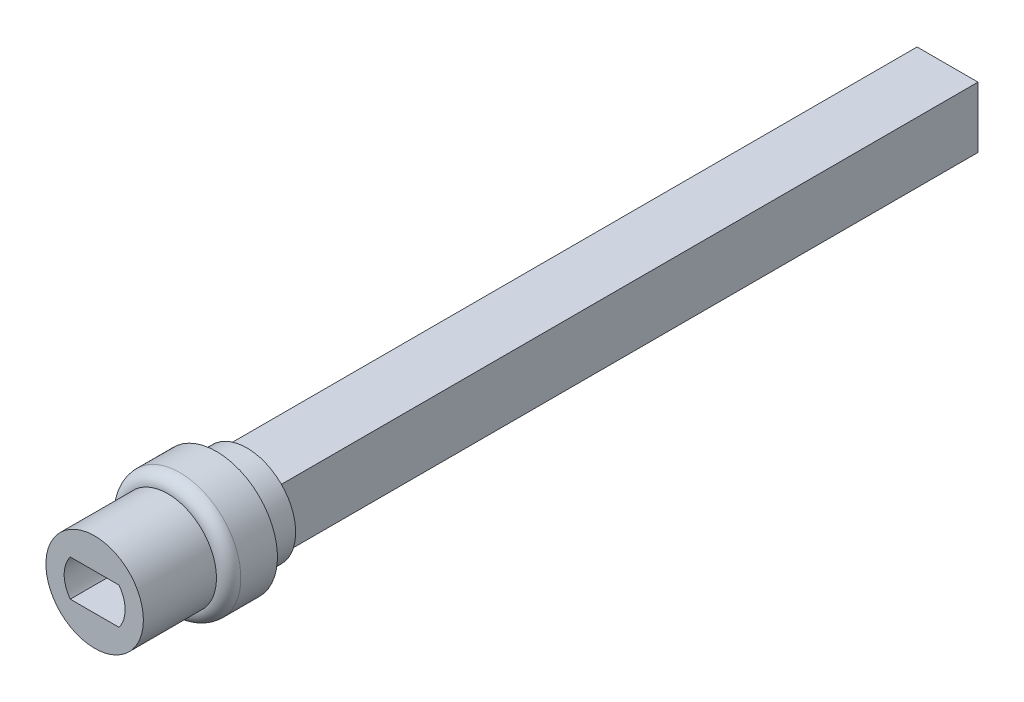
ISO-10303-21;
HEADER;
FILE_DESCRIPTION(('STEP AP214'),'2;1');
FILE_NAME('part.step','',(''),(''),'','','');
FILE_SCHEMA(('AUTOMOTIVE_DESIGN { 1 0 10303 214 1 1 1 1 }'));
ENDSEC;
DATA;
#1=APPLICATION_CONTEXT('core data for automotive mechanical design processes');
#2=APPLICATION_PROTOCOL_DEFINITION('international standard','automotive_design',2000,#1);
#3=PRODUCT_CONTEXT('',#1,'mechanical');
#4=PRODUCT('Part','Part','',(#3));
#5=PRODUCT_RELATED_PRODUCT_CATEGORY('part','',(#4));
#6=PRODUCT_DEFINITION_FORMATION('','',#4);
#7=PRODUCT_DEFINITION_CONTEXT('part definition',#1,'design');
#8=PRODUCT_DEFINITION('design','',#6,#7);
#9=PRODUCT_DEFINITION_SHAPE('','',#8);
#10=(LENGTH_UNIT() NAMED_UNIT(*) SI_UNIT(.MILLI.,.METRE.));
#11=(NAMED_UNIT(*) PLANE_ANGLE_UNIT() SI_UNIT($,.RADIAN.));
#12=(NAMED_UNIT(*) SI_UNIT($,.STERADIAN.) SOLID_ANGLE_UNIT());
#13=UNCERTAINTY_MEASURE_WITH_UNIT(LENGTH_MEASURE(1.E-05),#10,'distance_accuracy_value','');
#14=(GEOMETRIC_REPRESENTATION_CONTEXT(3) GLOBAL_UNCERTAINTY_ASSIGNED_CONTEXT((#13)) GLOBAL_UNIT_ASSIGNED_CONTEXT((#10,
#11,#12)) REPRESENTATION_CONTEXT('',''));
#15=CARTESIAN_POINT('',(0.,0.,0.));
#16=DIRECTION('',(0.,0.,1.));
#17=DIRECTION('',(1.,0.,0.));
#18=AXIS2_PLACEMENT_3D('',#15,#16,#17);
#19=CARTESIAN_POINT('',(0.,0.,6.));
#20=DIRECTION('',(0.,0.,1.));
#21=DIRECTION('',(1.,0.,0.));
#22=AXIS2_PLACEMENT_3D('',#19,#20,#21);
#23=PLANE('',#22);
#24=CARTESIAN_POINT('',(0.,0.,6.));
#25=DIRECTION('',(0.,0.,1.));
#26=DIRECTION('',(1.,0.,0.));
#27=AXIS2_PLACEMENT_3D('',#24,#25,#26);
#28=CIRCLE('',#27,4.);
#29=CARTESIAN_POINT('',(4.,0.,6.));
#30=VERTEX_POINT('',#29);
#31=EDGE_CURVE('E157',#30,#30,#28,.T.);
#32=ORIENTED_EDGE('',*,*,#31,.T.);
#33=EDGE_LOOP('',(#32));
#34=FACE_BOUND('',#33,.T.);
#35=DIRECTION('',(1.,0.,0.));
#36=VECTOR('',#35,1.);
#37=CARTESIAN_POINT('',(-2.,-1.5,6.));
#38=LINE('',#37,#36);
#39=CARTESIAN_POINT('',(-2.,-1.5,6.));
#40=VERTEX_POINT('',#39);
#41=CARTESIAN_POINT('',(2.,-1.5,6.));
#42=VERTEX_POINT('',#41);
#43=EDGE_CURVE('E131',#40,#42,#38,.T.);
#44=ORIENTED_EDGE('',*,*,#43,.F.);
#45=CARTESIAN_POINT('',(0.,0.,6.));
#46=DIRECTION('',(0.,0.,1.));
#47=DIRECTION('',(1.,0.,0.));
#48=AXIS2_PLACEMENT_3D('',#45,#46,#47);
#49=CIRCLE('',#48,2.5);
#50=CARTESIAN_POINT('',(-2.,1.5,6.));
#51=VERTEX_POINT('',#50);
#52=EDGE_CURVE('E129',#51,#40,#49,.T.);
#53=ORIENTED_EDGE('',*,*,#52,.F.);
#54=DIRECTION('',(-1.,0.,0.));
#55=VECTOR('',#54,1.);
#56=CARTESIAN_POINT('',(-2.,1.5,6.));
#57=LINE('',#56,#55);
#58=CARTESIAN_POINT('',(2.,1.5,6.));
#59=VERTEX_POINT('',#58);
#60=EDGE_CURVE('E136',#59,#51,#57,.T.);
#61=ORIENTED_EDGE('',*,*,#60,.F.);
#62=CARTESIAN_POINT('',(0.,0.,6.));
#63=DIRECTION('',(0.,0.,1.));
#64=DIRECTION('',(1.,0.,0.));
#65=AXIS2_PLACEMENT_3D('',#62,#63,#64);
#66=CIRCLE('',#65,2.5);
#67=EDGE_CURVE('E134',#42,#59,#66,.T.);
#68=ORIENTED_EDGE('',*,*,#67,.F.);
#69=EDGE_LOOP('',(#44,#53,#61,#68));
#70=FACE_BOUND('',#69,.T.);
#71=ADVANCED_FACE('F33',(#34,#70),#23,.T.);
#72=CARTESIAN_POINT('',(0.,0.,6.));
#73=DIRECTION('',(0.,0.,-1.));
#74=DIRECTION('',(-1.,0.,0.));
#75=AXIS2_PLACEMENT_3D('',#72,#73,#74);
#76=CYLINDRICAL_SURFACE('',#75,4.);
#77=ORIENTED_EDGE('',*,*,#31,.F.);
#78=EDGE_LOOP('',(#77));
#79=FACE_BOUND('',#78,.T.);
#80=CARTESIAN_POINT('',(0.,0.,0.));
#81=DIRECTION('',(0.,0.,1.));
#82=DIRECTION('',(1.,0.,0.));
#83=AXIS2_PLACEMENT_3D('',#80,#81,#82);
#84=CIRCLE('',#83,4.);
#85=CARTESIAN_POINT('',(4.,0.,0.));
#86=VERTEX_POINT('',#85);
#87=EDGE_CURVE('E128',#86,#86,#84,.T.);
#88=ORIENTED_EDGE('',*,*,#87,.T.);
#89=EDGE_LOOP('',(#88));
#90=FACE_BOUND('',#89,.T.);
#91=ADVANCED_FACE('F183',(#79,#90),#76,.T.);
#92=CARTESIAN_POINT('',(0.,0.,6.));
#93=DIRECTION('',(0.,0.,-1.));
#94=DIRECTION('',(-1.,0.,0.));
#95=AXIS2_PLACEMENT_3D('',#92,#93,#94);
#96=CYLINDRICAL_SURFACE('',#95,2.5);
#97=CARTESIAN_POINT('',(0.,0.,0.));
#98=DIRECTION('',(0.,0.,1.));
#99=DIRECTION('',(1.,0.,0.));
#100=AXIS2_PLACEMENT_3D('',#97,#98,#99);
#101=CIRCLE('',#100,2.5);
#102=CARTESIAN_POINT('',(-2.,1.5,0.));
#103=VERTEX_POINT('',#102);
#104=CARTESIAN_POINT('',(-2.,-1.5,0.));
#105=VERTEX_POINT('',#104);
#106=EDGE_CURVE('E139',#103,#105,#101,.T.);
#107=ORIENTED_EDGE('',*,*,#106,.F.);
#108=DIRECTION('',(0.,0.,-1.));
#109=VECTOR('',#108,1.);
#110=CARTESIAN_POINT('',(-2.,1.5,6.));
#111=LINE('',#110,#109);
#112=EDGE_CURVE('E138',#51,#103,#111,.T.);
#113=ORIENTED_EDGE('',*,*,#112,.F.);
#114=ORIENTED_EDGE('',*,*,#52,.T.);
#115=DIRECTION('',(0.,0.,-1.));
#116=VECTOR('',#115,1.);
#117=CARTESIAN_POINT('',(-2.,-1.5,6.));
#118=LINE('',#117,#116);
#119=EDGE_CURVE('E154',#40,#105,#118,.T.);
#120=ORIENTED_EDGE('',*,*,#119,.T.);
#121=EDGE_LOOP('',(#107,#113,#114,#120));
#122=FACE_BOUND('',#121,.T.);
#123=ADVANCED_FACE('F189',(#122),#96,.F.);
#124=CARTESIAN_POINT('',(-2.,-1.5,6.));
#125=DIRECTION('',(0.,1.,0.));
#126=DIRECTION('',(0.,0.,1.));
#127=AXIS2_PLACEMENT_3D('',#124,#125,#126);
#128=PLANE('',#127);
#129=DIRECTION('',(1.,0.,0.));
#130=VECTOR('',#129,1.);
#131=CARTESIAN_POINT('',(-2.,-1.5,0.));
#132=LINE('',#131,#130);
#133=CARTESIAN_POINT('',(2.,-1.5,0.));
#134=VERTEX_POINT('',#133);
#135=EDGE_CURVE('E142',#105,#134,#132,.T.);
#136=ORIENTED_EDGE('',*,*,#135,.F.);
#137=ORIENTED_EDGE('',*,*,#119,.F.);
#138=ORIENTED_EDGE('',*,*,#43,.T.);
#139=DIRECTION('',(0.,0.,-1.));
#140=VECTOR('',#139,1.);
#141=CARTESIAN_POINT('',(2.,-1.5,6.));
#142=LINE('',#141,#140);
#143=EDGE_CURVE('E152',#42,#134,#142,.T.);
#144=ORIENTED_EDGE('',*,*,#143,.T.);
#145=EDGE_LOOP('',(#136,#137,#138,#144));
#146=FACE_BOUND('',#145,.T.);
#147=ADVANCED_FACE('F195',(#146),#128,.T.);
#148=CARTESIAN_POINT('',(0.,0.,6.));
#149=DIRECTION('',(0.,0.,-1.));
#150=DIRECTION('',(-1.,0.,0.));
#151=AXIS2_PLACEMENT_3D('',#148,#149,#150);
#152=CYLINDRICAL_SURFACE('',#151,2.5);
#153=CARTESIAN_POINT('',(0.,0.,0.));
#154=DIRECTION('',(0.,0.,1.));
#155=DIRECTION('',(1.,0.,0.));
#156=AXIS2_PLACEMENT_3D('',#153,#154,#155);
#157=CIRCLE('',#156,2.5);
#158=CARTESIAN_POINT('',(2.,1.5,0.));
#159=VERTEX_POINT('',#158);
#160=EDGE_CURVE('E145',#134,#159,#157,.T.);
#161=ORIENTED_EDGE('',*,*,#160,.F.);
#162=ORIENTED_EDGE('',*,*,#143,.F.);
#163=ORIENTED_EDGE('',*,*,#67,.T.);
#164=DIRECTION('',(0.,0.,-1.));
#165=VECTOR('',#164,1.);
#166=CARTESIAN_POINT('',(2.,1.5,6.));
#167=LINE('',#166,#165);
#168=EDGE_CURVE('E55',#59,#159,#167,.T.);
#169=ORIENTED_EDGE('',*,*,#168,.T.);
#170=EDGE_LOOP('',(#161,#162,#163,#169));
#171=FACE_BOUND('',#170,.T.);
#172=ADVANCED_FACE('F199',(#171),#152,.F.);
#173=CARTESIAN_POINT('',(-2.,1.5,6.));
#174=DIRECTION('',(0.,-1.,0.));
#175=DIRECTION('',(0.,0.,-1.));
#176=AXIS2_PLACEMENT_3D('',#173,#174,#175);
#177=PLANE('',#176);
#178=DIRECTION('',(-1.,0.,0.));
#179=VECTOR('',#178,1.);
#180=CARTESIAN_POINT('',(-2.,1.5,0.));
#181=LINE('',#180,#179);
#182=EDGE_CURVE('E132',#159,#103,#181,.T.);
#183=ORIENTED_EDGE('',*,*,#182,.F.);
#184=ORIENTED_EDGE('',*,*,#168,.F.);
#185=ORIENTED_EDGE('',*,*,#60,.T.);
#186=ORIENTED_EDGE('',*,*,#112,.T.);
#187=EDGE_LOOP('',(#183,#184,#185,#186));
#188=FACE_BOUND('',#187,.T.);
#189=ADVANCED_FACE('F203',(#188),#177,.T.);
#190=CARTESIAN_POINT('',(0.,0.,0.));
#191=DIRECTION('',(0.,0.,-1.));
#192=DIRECTION('',(-1.,0.,0.));
#193=AXIS2_PLACEMENT_3D('',#190,#191,#192);
#194=PLANE('',#193);
#195=ORIENTED_EDGE('',*,*,#182,.T.);
#196=ORIENTED_EDGE('',*,*,#106,.T.);
#197=ORIENTED_EDGE('',*,*,#135,.T.);
#198=ORIENTED_EDGE('',*,*,#160,.T.);
#199=EDGE_LOOP('',(#195,#196,#197,#198));
#200=FACE_BOUND('',#199,.T.);
#201=ADVANCED_FACE('F207',(#200),#194,.F.);
#202=CARTESIAN_POINT('',(0.,0.,-4.));
#203=DIRECTION('',(0.,0.,1.));
#204=DIRECTION('',(1.,0.,0.));
#205=AXIS2_PLACEMENT_3D('',#202,#203,#204);
#206=CYLINDRICAL_SURFACE('',#205,5.);
#207=CARTESIAN_POINT('',(0.,0.,-1.));
#208=DIRECTION('',(0.,0.,-1.));
#209=DIRECTION('',(-1.,0.,0.));
#210=AXIS2_PLACEMENT_3D('',#207,#208,#209);
#211=CIRCLE('',#210,5.);
#212=CARTESIAN_POINT('',(-5.,0.,-1.));
#213=VERTEX_POINT('',#212);
#214=EDGE_CURVE('E41',#213,#213,#211,.T.);
#215=ORIENTED_EDGE('',*,*,#214,.T.);
#216=EDGE_LOOP('',(#215));
#217=FACE_BOUND('',#216,.T.);
#218=CARTESIAN_POINT('',(0.,0.,-4.));
#219=DIRECTION('',(0.,0.,-1.));
#220=DIRECTION('',(-1.,0.,0.));
#221=AXIS2_PLACEMENT_3D('',#218,#219,#220);
#222=CIRCLE('',#221,5.);
#223=CARTESIAN_POINT('',(-5.,0.,-4.));
#224=VERTEX_POINT('',#223);
#225=EDGE_CURVE('E125',#224,#224,#222,.T.);
#226=ORIENTED_EDGE('',*,*,#225,.F.);
#227=EDGE_LOOP('',(#226));
#228=FACE_BOUND('',#227,.T.);
#229=ADVANCED_FACE('F164',(#217,#228),#206,.T.);
#230=CARTESIAN_POINT('',(0.,0.,-4.));
#231=DIRECTION('',(0.,0.,-1.));
#232=DIRECTION('',(-1.,0.,0.));
#233=AXIS2_PLACEMENT_3D('',#230,#231,#232);
#234=PLANE('',#233);
#235=CARTESIAN_POINT('',(0.,0.,-4.));
#236=DIRECTION('',(0.,0.,-1.));
#237=DIRECTION('',(-1.,0.,0.));
#238=AXIS2_PLACEMENT_3D('',#235,#236,#237);
#239=CIRCLE('',#238,4.);
#240=CARTESIAN_POINT('',(-4.,0.,-4.));
#241=VERTEX_POINT('',#240);
#242=EDGE_CURVE('E238',#241,#241,#239,.T.);
#243=ORIENTED_EDGE('',*,*,#242,.F.);
#244=EDGE_LOOP('',(#243));
#245=FACE_BOUND('',#244,.T.);
#246=ORIENTED_EDGE('',*,*,#225,.T.);
#247=EDGE_LOOP('',(#246));
#248=FACE_BOUND('',#247,.T.);
#249=ADVANCED_FACE('F168',(#245,#248),#234,.T.);
#250=CARTESIAN_POINT('',(0.,0.,-1.));
#251=DIRECTION('',(0.,0.,-1.));
#252=DIRECTION('',(-1.,0.,0.));
#253=AXIS2_PLACEMENT_3D('',#250,#251,#252);
#254=TOROIDAL_SURFACE('',#253,4.,1.);
#255=ORIENTED_EDGE('',*,*,#87,.F.);
#256=EDGE_LOOP('',(#255));
#257=FACE_BOUND('',#256,.T.);
#258=ORIENTED_EDGE('',*,*,#214,.F.);
#259=EDGE_LOOP('',(#258));
#260=FACE_BOUND('',#259,.T.);
#261=ADVANCED_FACE('F35',(#257,#260),#254,.T.);
#262=CARTESIAN_POINT('',(0.,0.,-6.5));
#263=DIRECTION('',(0.,0.,-1.));
#264=DIRECTION('',(-1.,0.,0.));
#265=AXIS2_PLACEMENT_3D('',#262,#263,#264);
#266=PLANE('',#265);
#267=CARTESIAN_POINT('',(0.,0.,-6.5));
#268=DIRECTION('',(0.,0.,-1.));
#269=DIRECTION('',(-1.,0.,0.));
#270=AXIS2_PLACEMENT_3D('',#267,#268,#269);
#271=CIRCLE('',#270,4.);
#272=CARTESIAN_POINT('',(-4.,0.,-6.5));
#273=VERTEX_POINT('',#272);
#274=EDGE_CURVE('E112',#273,#273,#271,.T.);
#275=ORIENTED_EDGE('',*,*,#274,.T.);
#276=EDGE_LOOP('',(#275));
#277=FACE_BOUND('',#276,.T.);
#278=DIRECTION('',(0.,-1.,0.));
#279=VECTOR('',#278,1.);
#280=CARTESIAN_POINT('',(2.5,-2.5,-6.5));
#281=LINE('',#280,#279);
#282=CARTESIAN_POINT('',(2.5,2.5,-6.50000000000001));
#283=VERTEX_POINT('',#282);
#284=CARTESIAN_POINT('',(2.5,-2.5,-6.5));
#285=VERTEX_POINT('',#284);
#286=EDGE_CURVE('E48',#283,#285,#281,.T.);
#287=ORIENTED_EDGE('',*,*,#286,.F.);
#288=DIRECTION('',(1.,0.,0.));
#289=VECTOR('',#288,1.);
#290=CARTESIAN_POINT('',(-2.5,2.5,-6.5));
#291=LINE('',#290,#289);
#292=CARTESIAN_POINT('',(-2.5,2.5,-6.5));
#293=VERTEX_POINT('',#292);
#294=EDGE_CURVE('E11',#293,#283,#291,.T.);
#295=ORIENTED_EDGE('',*,*,#294,.F.);
#296=DIRECTION('',(0.,1.,0.));
#297=VECTOR('',#296,1.);
#298=CARTESIAN_POINT('',(-2.5,-2.5,-6.5));
#299=LINE('',#298,#297);
#300=CARTESIAN_POINT('',(-2.5,-2.5,-6.5));
#301=VERTEX_POINT('',#300);
#302=EDGE_CURVE('E96',#301,#293,#299,.T.);
#303=ORIENTED_EDGE('',*,*,#302,.F.);
#304=DIRECTION('',(-1.,0.,0.));
#305=VECTOR('',#304,1.);
#306=CARTESIAN_POINT('',(-2.5,-2.5,-6.5));
#307=LINE('',#306,#305);
#308=EDGE_CURVE('E111',#285,#301,#307,.T.);
#309=ORIENTED_EDGE('',*,*,#308,.F.);
#310=EDGE_LOOP('',(#287,#295,#303,#309));
#311=FACE_BOUND('',#310,.T.);
#312=ADVANCED_FACE('F95',(#277,#311),#266,.T.);
#313=CARTESIAN_POINT('',(0.,0.,-6.5));
#314=DIRECTION('',(0.,0.,1.));
#315=DIRECTION('',(1.,0.,0.));
#316=AXIS2_PLACEMENT_3D('',#313,#314,#315);
#317=CYLINDRICAL_SURFACE('',#316,4.);
#318=ORIENTED_EDGE('',*,*,#274,.F.);
#319=EDGE_LOOP('',(#318));
#320=FACE_BOUND('',#319,.T.);
#321=ORIENTED_EDGE('',*,*,#242,.T.);
#322=EDGE_LOOP('',(#321));
#323=FACE_BOUND('',#322,.T.);
#324=ADVANCED_FACE('F175',(#320,#323),#317,.T.);
#325=CARTESIAN_POINT('',(0.,0.,-64.));
#326=DIRECTION('',(0.,0.,-1.));
#327=DIRECTION('',(-1.,0.,0.));
#328=AXIS2_PLACEMENT_3D('',#325,#326,#327);
#329=PLANE('',#328);
#330=DIRECTION('',(0.,-1.,0.));
#331=VECTOR('',#330,1.);
#332=CARTESIAN_POINT('',(2.5,-2.5,-64.));
#333=LINE('',#332,#331);
#334=CARTESIAN_POINT('',(2.5,2.5,-64.));
#335=VERTEX_POINT('',#334);
#336=CARTESIAN_POINT('',(2.5,-2.5,-64.));
#337=VERTEX_POINT('',#336);
#338=EDGE_CURVE('E244',#335,#337,#333,.T.);
#339=ORIENTED_EDGE('',*,*,#338,.T.);
#340=DIRECTION('',(-1.,0.,0.));
#341=VECTOR('',#340,1.);
#342=CARTESIAN_POINT('',(-2.5,-2.5,-64.));
#343=LINE('',#342,#341);
#344=CARTESIAN_POINT('',(-2.5,-2.5,-64.));
#345=VERTEX_POINT('',#344);
#346=EDGE_CURVE('E247',#337,#345,#343,.T.);
#347=ORIENTED_EDGE('',*,*,#346,.T.);
#348=DIRECTION('',(0.,1.,0.));
#349=VECTOR('',#348,1.);
#350=CARTESIAN_POINT('',(-2.5,-2.5,-64.));
#351=LINE('',#350,#349);
#352=CARTESIAN_POINT('',(-2.5,2.5,-64.));
#353=VERTEX_POINT('',#352);
#354=EDGE_CURVE('E249',#345,#353,#351,.T.);
#355=ORIENTED_EDGE('',*,*,#354,.T.);
#356=DIRECTION('',(1.,0.,0.));
#357=VECTOR('',#356,1.);
#358=CARTESIAN_POINT('',(-2.5,2.5,-64.));
#359=LINE('',#358,#357);
#360=EDGE_CURVE('E115',#353,#335,#359,.T.);
#361=ORIENTED_EDGE('',*,*,#360,.T.);
#362=EDGE_LOOP('',(#339,#347,#355,#361));
#363=FACE_BOUND('',#362,.T.);
#364=ADVANCED_FACE('F225',(#363),#329,.T.);
#365=CARTESIAN_POINT('',(-2.5,2.5,-64.));
#366=DIRECTION('',(0.,-1.,0.));
#367=DIRECTION('',(1.,0.,0.));
#368=AXIS2_PLACEMENT_3D('',#365,#366,#367);
#369=PLANE('',#368);
#370=DIRECTION('',(0.,0.,1.));
#371=VECTOR('',#370,1.);
#372=CARTESIAN_POINT('',(-2.5,2.5,-64.));
#373=LINE('',#372,#371);
#374=EDGE_CURVE('E107',#353,#293,#373,.T.);
#375=ORIENTED_EDGE('',*,*,#374,.T.);
#376=ORIENTED_EDGE('',*,*,#294,.T.);
#377=DIRECTION('',(0.,0.,1.));
#378=VECTOR('',#377,1.);
#379=CARTESIAN_POINT('',(2.5,2.5,-64.));
#380=LINE('',#379,#378);
#381=EDGE_CURVE('E116',#335,#283,#380,.T.);
#382=ORIENTED_EDGE('',*,*,#381,.F.);
#383=ORIENTED_EDGE('',*,*,#360,.F.);
#384=EDGE_LOOP('',(#375,#376,#382,#383));
#385=FACE_BOUND('',#384,.T.);
#386=ADVANCED_FACE('F114',(#385),#369,.F.);
#387=CARTESIAN_POINT('',(-2.5,-2.5,-64.));
#388=DIRECTION('',(1.,0.,0.));
#389=DIRECTION('',(0.,0.,-1.));
#390=AXIS2_PLACEMENT_3D('',#387,#388,#389);
#391=PLANE('',#390);
#392=DIRECTION('',(0.,0.,1.));
#393=VECTOR('',#392,1.);
#394=CARTESIAN_POINT('',(-2.5,-2.5,-64.));
#395=LINE('',#394,#393);
#396=EDGE_CURVE('E110',#345,#301,#395,.T.);
#397=ORIENTED_EDGE('',*,*,#396,.T.);
#398=ORIENTED_EDGE('',*,*,#302,.T.);
#399=ORIENTED_EDGE('',*,*,#374,.F.);
#400=ORIENTED_EDGE('',*,*,#354,.F.);
#401=EDGE_LOOP('',(#397,#398,#399,#400));
#402=FACE_BOUND('',#401,.T.);
#403=ADVANCED_FACE('F105',(#402),#391,.F.);
#404=CARTESIAN_POINT('',(-2.5,-2.5,-64.));
#405=DIRECTION('',(0.,1.,0.));
#406=DIRECTION('',(-1.,0.,0.));
#407=AXIS2_PLACEMENT_3D('',#404,#405,#406);
#408=PLANE('',#407);
#409=DIRECTION('',(0.,0.,1.));
#410=VECTOR('',#409,1.);
#411=CARTESIAN_POINT('',(2.5,-2.5,-64.));
#412=LINE('',#411,#410);
#413=EDGE_CURVE('E118',#337,#285,#412,.T.);
#414=ORIENTED_EDGE('',*,*,#413,.T.);
#415=ORIENTED_EDGE('',*,*,#308,.T.);
#416=ORIENTED_EDGE('',*,*,#396,.F.);
#417=ORIENTED_EDGE('',*,*,#346,.F.);
#418=EDGE_LOOP('',(#414,#415,#416,#417));
#419=FACE_BOUND('',#418,.T.);
#420=ADVANCED_FACE('F216',(#419),#408,.F.);
#421=CARTESIAN_POINT('',(2.5,-2.5,-64.));
#422=DIRECTION('',(-1.,0.,0.));
#423=DIRECTION('',(0.,0.,1.));
#424=AXIS2_PLACEMENT_3D('',#421,#422,#423);
#425=PLANE('',#424);
#426=ORIENTED_EDGE('',*,*,#381,.T.);
#427=ORIENTED_EDGE('',*,*,#286,.T.);
#428=ORIENTED_EDGE('',*,*,#413,.F.);
#429=ORIENTED_EDGE('',*,*,#338,.F.);
#430=EDGE_LOOP('',(#426,#427,#428,#429));
#431=FACE_BOUND('',#430,.T.);
#432=ADVANCED_FACE('F213',(#431),#425,.F.);
#433=CLOSED_SHELL('',(#71,#91,#123,#147,#172,#189,#201,#229,#249,#261,#312,#324,#364,#386,#403,
#420,#432));
#434=MANIFOLD_SOLID_BREP('B2',#433);
#435=ADVANCED_BREP_SHAPE_REPRESENTATION('',(#18,#434),#14);
#436=SHAPE_DEFINITION_REPRESENTATION(#9,#435);
ENDSEC;
END-ISO-10303-21;
